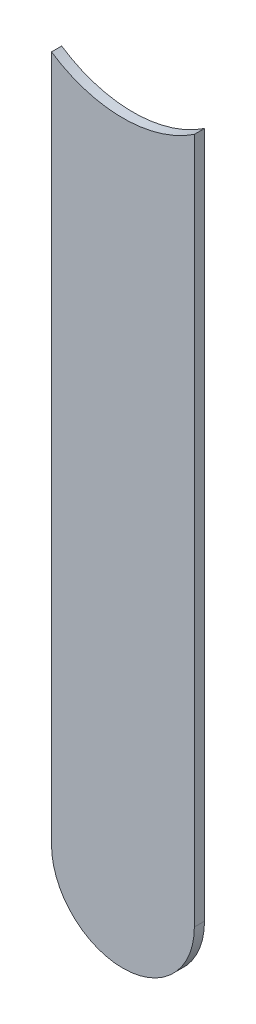
ISO-10303-21;
HEADER;
FILE_DESCRIPTION(('STEP AP214'),'2;1');
FILE_NAME('part.step','',(''),(''),'','','');
FILE_SCHEMA(('AUTOMOTIVE_DESIGN { 1 0 10303 214 1 1 1 1 }'));
ENDSEC;
DATA;
#1=APPLICATION_CONTEXT('core data for automotive mechanical design processes');
#2=APPLICATION_PROTOCOL_DEFINITION('international standard','automotive_design',2000,#1);
#3=PRODUCT_CONTEXT('',#1,'mechanical');
#4=PRODUCT('Part','Part','',(#3));
#5=PRODUCT_RELATED_PRODUCT_CATEGORY('part','',(#4));
#6=PRODUCT_DEFINITION_FORMATION('','',#4);
#7=PRODUCT_DEFINITION_CONTEXT('part definition',#1,'design');
#8=PRODUCT_DEFINITION('design','',#6,#7);
#9=PRODUCT_DEFINITION_SHAPE('','',#8);
#10=(LENGTH_UNIT() NAMED_UNIT(*) SI_UNIT(.MILLI.,.METRE.));
#11=(NAMED_UNIT(*) PLANE_ANGLE_UNIT() SI_UNIT($,.RADIAN.));
#12=(NAMED_UNIT(*) SI_UNIT($,.STERADIAN.) SOLID_ANGLE_UNIT());
#13=UNCERTAINTY_MEASURE_WITH_UNIT(LENGTH_MEASURE(1.E-05),#10,'distance_accuracy_value','');
#14=(GEOMETRIC_REPRESENTATION_CONTEXT(3) GLOBAL_UNCERTAINTY_ASSIGNED_CONTEXT((#13)) GLOBAL_UNIT_ASSIGNED_CONTEXT((#10,
#11,#12)) REPRESENTATION_CONTEXT('',''));
#15=CARTESIAN_POINT('',(0.,0.,0.));
#16=DIRECTION('',(0.,0.,1.));
#17=DIRECTION('',(1.,0.,0.));
#18=AXIS2_PLACEMENT_3D('',#15,#16,#17);
#19=CARTESIAN_POINT('',(91.5410031,91.390978,0.));
#20=DIRECTION('',(-1.,0.,0.));
#21=DIRECTION('',(0.,1.,0.));
#22=AXIS2_PLACEMENT_3D('',#19,#20,#21);
#23=PLANE('',#22);
#24=DIRECTION('',(0.,1.,0.));
#25=VECTOR('',#24,1.);
#26=CARTESIAN_POINT('',(91.5410031,91.390978,0.03556));
#27=LINE('',#26,#25);
#28=CARTESIAN_POINT('',(91.5410031,91.390978,0.03556));
#29=VERTEX_POINT('',#28);
#30=CARTESIAN_POINT('',(91.5410031,93.7938458096541,0.03556));
#31=VERTEX_POINT('',#30);
#32=EDGE_CURVE('E11',#29,#31,#27,.T.);
#33=ORIENTED_EDGE('',*,*,#32,.F.);
#34=DIRECTION('',(0.,0.,1.));
#35=VECTOR('',#34,1.);
#36=CARTESIAN_POINT('',(91.5410031,91.390978,0.));
#37=LINE('',#36,#35);
#38=CARTESIAN_POINT('',(91.5410031,91.390978,0.));
#39=VERTEX_POINT('',#38);
#40=EDGE_CURVE('E24',#39,#29,#37,.T.);
#41=ORIENTED_EDGE('',*,*,#40,.F.);
#42=DIRECTION('',(0.,1.,0.));
#43=VECTOR('',#42,1.);
#44=CARTESIAN_POINT('',(91.5410031,91.390978,0.));
#45=LINE('',#44,#43);
#46=CARTESIAN_POINT('',(91.5410031,93.7938458096541,0.));
#47=VERTEX_POINT('',#46);
#48=EDGE_CURVE('E75',#39,#47,#45,.T.);
#49=ORIENTED_EDGE('',*,*,#48,.T.);
#50=DIRECTION('',(0.,0.,1.));
#51=VECTOR('',#50,1.);
#52=CARTESIAN_POINT('',(91.5410031,93.7938458096541,0.));
#53=LINE('',#52,#51);
#54=EDGE_CURVE('E37',#47,#31,#53,.T.);
#55=ORIENTED_EDGE('',*,*,#54,.T.);
#56=EDGE_LOOP('',(#33,#41,#49,#55));
#57=FACE_BOUND('',#56,.T.);
#58=ADVANCED_FACE('F17',(#57),#23,.F.);
#59=CARTESIAN_POINT('',(91.2910036,94.1680108,0.));
#60=DIRECTION('',(0.,0.,-1.));
#61=DIRECTION('',(1.,0.,0.));
#62=AXIS2_PLACEMENT_3D('',#59,#60,#61);
#63=CYLINDRICAL_SURFACE('',#62,0.4499991);
#64=DIRECTION('',(0.,0.,1.));
#65=VECTOR('',#64,1.);
#66=CARTESIAN_POINT('',(91.0410041,93.7938458096541,0.));
#67=LINE('',#66,#65);
#68=CARTESIAN_POINT('',(91.0410041,93.7938458096541,0.));
#69=VERTEX_POINT('',#68);
#70=CARTESIAN_POINT('',(91.0410041,93.7938458096541,0.03556));
#71=VERTEX_POINT('',#70);
#72=EDGE_CURVE('E67',#69,#71,#67,.T.);
#73=ORIENTED_EDGE('',*,*,#72,.T.);
#74=CARTESIAN_POINT('',(91.2910036,94.1680108,0.03556));
#75=DIRECTION('',(0.,0.,1.));
#76=DIRECTION('',(1.,0.,0.));
#77=AXIS2_PLACEMENT_3D('',#74,#75,#76);
#78=CIRCLE('',#77,0.4499991);
#79=EDGE_CURVE('E82',#71,#31,#78,.T.);
#80=ORIENTED_EDGE('',*,*,#79,.T.);
#81=ORIENTED_EDGE('',*,*,#54,.F.);
#82=CARTESIAN_POINT('',(91.2910036,94.1680108,0.));
#83=DIRECTION('',(0.,0.,1.));
#84=DIRECTION('',(1.,0.,0.));
#85=AXIS2_PLACEMENT_3D('',#82,#83,#84);
#86=CIRCLE('',#85,0.4499991);
#87=EDGE_CURVE('E80',#69,#47,#86,.T.);
#88=ORIENTED_EDGE('',*,*,#87,.F.);
#89=EDGE_LOOP('',(#73,#80,#81,#88));
#90=FACE_BOUND('',#89,.T.);
#91=ADVANCED_FACE('F88',(#90),#63,.F.);
#92=CARTESIAN_POINT('',(91.0410041,93.7938458096541,0.));
#93=DIRECTION('',(1.,0.,0.));
#94=DIRECTION('',(0.,-1.,0.));
#95=AXIS2_PLACEMENT_3D('',#92,#93,#94);
#96=PLANE('',#95);
#97=DIRECTION('',(0.,-1.,0.));
#98=VECTOR('',#97,1.);
#99=CARTESIAN_POINT('',(91.0410041,94.1680108,0.03556));
#100=LINE('',#99,#98);
#101=CARTESIAN_POINT('',(91.0410041,91.390978,0.03556));
#102=VERTEX_POINT('',#101);
#103=EDGE_CURVE('E71',#71,#102,#100,.T.);
#104=ORIENTED_EDGE('',*,*,#103,.F.);
#105=ORIENTED_EDGE('',*,*,#72,.F.);
#106=DIRECTION('',(0.,-1.,0.));
#107=VECTOR('',#106,1.);
#108=CARTESIAN_POINT('',(91.0410041,94.1680108,0.));
#109=LINE('',#108,#107);
#110=CARTESIAN_POINT('',(91.0410041,91.390978,0.));
#111=VERTEX_POINT('',#110);
#112=EDGE_CURVE('E63',#69,#111,#109,.T.);
#113=ORIENTED_EDGE('',*,*,#112,.T.);
#114=DIRECTION('',(0.,0.,1.));
#115=VECTOR('',#114,1.);
#116=CARTESIAN_POINT('',(91.0410041,91.390978,0.));
#117=LINE('',#116,#115);
#118=EDGE_CURVE('E53',#111,#102,#117,.T.);
#119=ORIENTED_EDGE('',*,*,#118,.T.);
#120=EDGE_LOOP('',(#104,#105,#113,#119));
#121=FACE_BOUND('',#120,.T.);
#122=ADVANCED_FACE('F66',(#121),#96,.F.);
#123=CARTESIAN_POINT('',(91.2910036,91.390978,0.));
#124=DIRECTION('',(0.,0.,-1.));
#125=DIRECTION('',(-1.,0.,0.));
#126=AXIS2_PLACEMENT_3D('',#123,#124,#125);
#127=CYLINDRICAL_SURFACE('',#126,0.249999500000001);
#128=CARTESIAN_POINT('',(91.2910036,91.390978,0.03556));
#129=DIRECTION('',(0.,0.,1.));
#130=DIRECTION('',(-1.,0.,0.));
#131=AXIS2_PLACEMENT_3D('',#128,#129,#130);
#132=CIRCLE('',#131,0.249999500000001);
#133=EDGE_CURVE('E59',#102,#29,#132,.T.);
#134=ORIENTED_EDGE('',*,*,#133,.F.);
#135=ORIENTED_EDGE('',*,*,#118,.F.);
#136=CARTESIAN_POINT('',(91.2910036,91.390978,0.));
#137=DIRECTION('',(0.,0.,1.));
#138=DIRECTION('',(-1.,0.,0.));
#139=AXIS2_PLACEMENT_3D('',#136,#137,#138);
#140=CIRCLE('',#139,0.249999500000001);
#141=EDGE_CURVE('E57',#111,#39,#140,.T.);
#142=ORIENTED_EDGE('',*,*,#141,.T.);
#143=ORIENTED_EDGE('',*,*,#40,.T.);
#144=EDGE_LOOP('',(#134,#135,#142,#143));
#145=FACE_BOUND('',#144,.T.);
#146=ADVANCED_FACE('F55',(#145),#127,.T.);
#147=CARTESIAN_POINT('',(91.5410031,91.390978,0.));
#148=DIRECTION('',(0.,0.,-1.));
#149=DIRECTION('',(-1.,0.,0.));
#150=AXIS2_PLACEMENT_3D('',#147,#148,#149);
#151=PLANE('',#150);
#152=ORIENTED_EDGE('',*,*,#48,.F.);
#153=ORIENTED_EDGE('',*,*,#141,.F.);
#154=ORIENTED_EDGE('',*,*,#112,.F.);
#155=ORIENTED_EDGE('',*,*,#87,.T.);
#156=EDGE_LOOP('',(#152,#153,#154,#155));
#157=FACE_BOUND('',#156,.T.);
#158=ADVANCED_FACE('F74',(#157),#151,.T.);
#159=CARTESIAN_POINT('',(91.5410031,91.390978,0.03556));
#160=DIRECTION('',(0.,0.,-1.));
#161=DIRECTION('',(-1.,0.,0.));
#162=AXIS2_PLACEMENT_3D('',#159,#160,#161);
#163=PLANE('',#162);
#164=ORIENTED_EDGE('',*,*,#133,.T.);
#165=ORIENTED_EDGE('',*,*,#32,.T.);
#166=ORIENTED_EDGE('',*,*,#79,.F.);
#167=ORIENTED_EDGE('',*,*,#103,.T.);
#168=EDGE_LOOP('',(#164,#165,#166,#167));
#169=FACE_BOUND('',#168,.T.);
#170=ADVANCED_FACE('F91',(#169),#163,.F.);
#171=CLOSED_SHELL('',(#58,#91,#122,#146,#158,#170));
#172=MANIFOLD_SOLID_BREP('B1',#171);
#173=ADVANCED_BREP_SHAPE_REPRESENTATION('',(#18,#172),#14);
#174=SHAPE_DEFINITION_REPRESENTATION(#9,#173);
ENDSEC;
END-ISO-10303-21;
